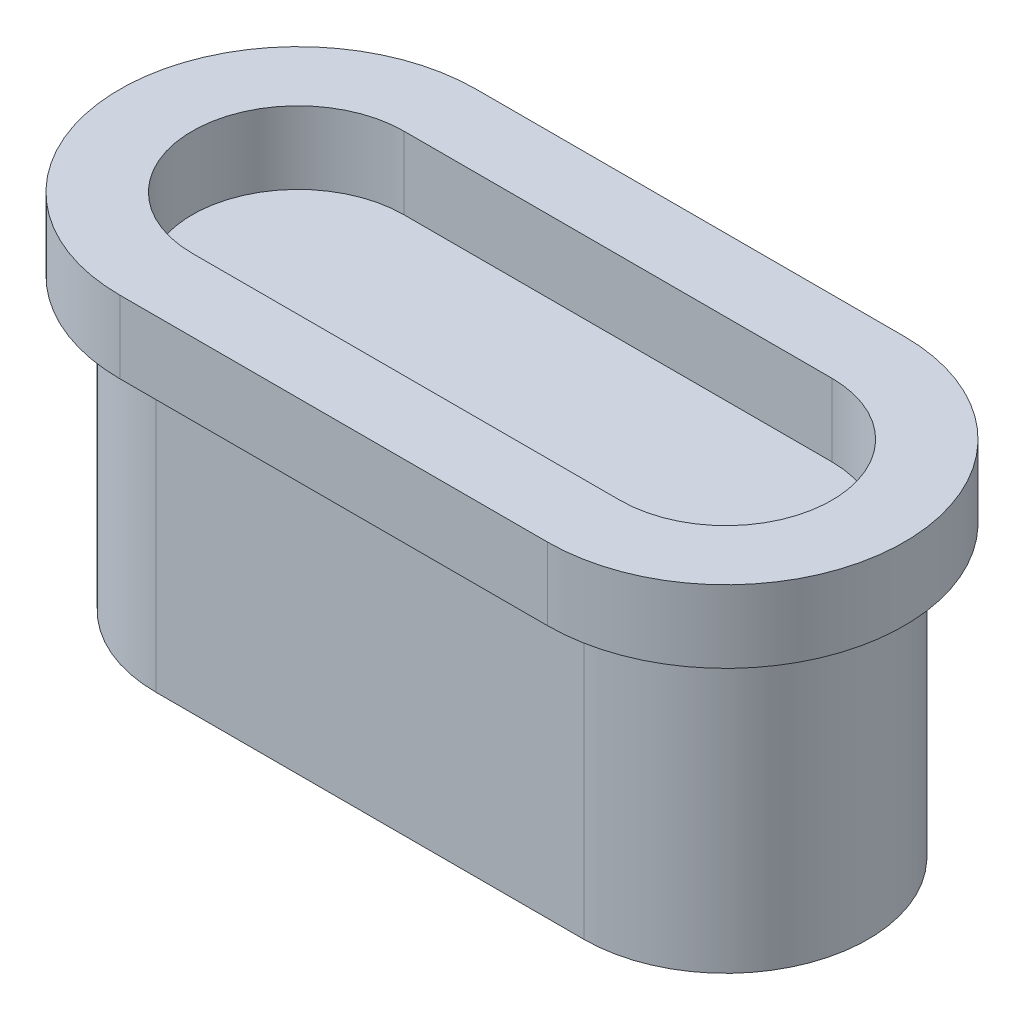
ISO-10303-21;
HEADER;
FILE_DESCRIPTION(('STEP AP214'),'2;1');
FILE_NAME('part.step','',(''),(''),'','','');
FILE_SCHEMA(('AUTOMOTIVE_DESIGN { 1 0 10303 214 1 1 1 1 }'));
ENDSEC;
DATA;
#1=APPLICATION_CONTEXT('core data for automotive mechanical design processes');
#2=APPLICATION_PROTOCOL_DEFINITION('international standard','automotive_design',2000,#1);
#3=PRODUCT_CONTEXT('',#1,'mechanical');
#4=PRODUCT('Part','Part','',(#3));
#5=PRODUCT_RELATED_PRODUCT_CATEGORY('part','',(#4));
#6=PRODUCT_DEFINITION_FORMATION('','',#4);
#7=PRODUCT_DEFINITION_CONTEXT('part definition',#1,'design');
#8=PRODUCT_DEFINITION('design','',#6,#7);
#9=PRODUCT_DEFINITION_SHAPE('','',#8);
#10=(LENGTH_UNIT() NAMED_UNIT(*) SI_UNIT(.MILLI.,.METRE.));
#11=(NAMED_UNIT(*) PLANE_ANGLE_UNIT() SI_UNIT($,.RADIAN.));
#12=(NAMED_UNIT(*) SI_UNIT($,.STERADIAN.) SOLID_ANGLE_UNIT());
#13=UNCERTAINTY_MEASURE_WITH_UNIT(LENGTH_MEASURE(1.E-05),#10,'distance_accuracy_value','');
#14=(GEOMETRIC_REPRESENTATION_CONTEXT(3) GLOBAL_UNCERTAINTY_ASSIGNED_CONTEXT((#13)) GLOBAL_UNIT_ASSIGNED_CONTEXT((#10,
#11,#12)) REPRESENTATION_CONTEXT('',''));
#15=CARTESIAN_POINT('',(0.,0.,0.));
#16=DIRECTION('',(0.,0.,1.));
#17=DIRECTION('',(1.,0.,0.));
#18=AXIS2_PLACEMENT_3D('',#15,#16,#17);
#19=CARTESIAN_POINT('',(0.,-20.,0.));
#20=DIRECTION('',(0.,1.,0.));
#21=DIRECTION('',(0.,0.,1.));
#22=AXIS2_PLACEMENT_3D('',#19,#20,#21);
#23=CYLINDRICAL_SURFACE('',#22,19.6126277365978);
#24=DIRECTION('',(0.,1.,0.));
#25=VECTOR('',#24,1.);
#26=CARTESIAN_POINT('',(0.,-20.,19.6126277365978));
#27=LINE('',#26,#25);
#28=CARTESIAN_POINT('',(0.,-20.,19.6126277365978));
#29=VERTEX_POINT('',#28);
#30=CARTESIAN_POINT('',(0.,20.,19.6126277365978));
#31=VERTEX_POINT('',#30);
#32=EDGE_CURVE('E66',#29,#31,#27,.T.);
#33=ORIENTED_EDGE('',*,*,#32,.T.);
#34=CARTESIAN_POINT('',(0.,20.,0.));
#35=DIRECTION('',(0.,1.,0.));
#36=DIRECTION('',(0.,0.,1.));
#37=AXIS2_PLACEMENT_3D('',#34,#35,#36);
#38=CIRCLE('',#37,19.6126277365978);
#39=CARTESIAN_POINT('',(0.,20.,-19.6126277365978));
#40=VERTEX_POINT('',#39);
#41=EDGE_CURVE('E217',#40,#31,#38,.T.);
#42=ORIENTED_EDGE('',*,*,#41,.F.);
#43=DIRECTION('',(0.,1.,0.));
#44=VECTOR('',#43,1.);
#45=CARTESIAN_POINT('',(0.,-20.,-19.6126277365978));
#46=LINE('',#45,#44);
#47=CARTESIAN_POINT('',(0.,-20.,-19.6126277365978));
#48=VERTEX_POINT('',#47);
#49=EDGE_CURVE('E12',#48,#40,#46,.T.);
#50=ORIENTED_EDGE('',*,*,#49,.F.);
#51=CARTESIAN_POINT('',(0.,-20.,0.));
#52=DIRECTION('',(0.,1.,0.));
#53=DIRECTION('',(0.,0.,1.));
#54=AXIS2_PLACEMENT_3D('',#51,#52,#53);
#55=CIRCLE('',#54,19.6126277365978);
#56=EDGE_CURVE('E229',#48,#29,#55,.T.);
#57=ORIENTED_EDGE('',*,*,#56,.T.);
#58=EDGE_LOOP('',(#33,#42,#50,#57));
#59=FACE_BOUND('',#58,.T.);
#60=ADVANCED_FACE('F63',(#59),#23,.T.);
#61=CARTESIAN_POINT('',(0.,-20.,-19.6126277365978));
#62=DIRECTION('',(0.,0.,-1.));
#63=DIRECTION('',(-1.,0.,0.));
#64=AXIS2_PLACEMENT_3D('',#61,#62,#63);
#65=PLANE('',#64);
#66=ORIENTED_EDGE('',*,*,#49,.T.);
#67=DIRECTION('',(-1.,0.,0.));
#68=VECTOR('',#67,1.);
#69=CARTESIAN_POINT('',(0.,20.,-19.6126277365978));
#70=LINE('',#69,#68);
#71=CARTESIAN_POINT('',(59.0925926609183,20.,-19.6126277365978));
#72=VERTEX_POINT('',#71);
#73=EDGE_CURVE('E226',#72,#40,#70,.T.);
#74=ORIENTED_EDGE('',*,*,#73,.F.);
#75=DIRECTION('',(0.,1.,0.));
#76=VECTOR('',#75,1.);
#77=CARTESIAN_POINT('',(59.0925926609183,-20.,-19.6126277365978));
#78=LINE('',#77,#76);
#79=CARTESIAN_POINT('',(59.0925926609183,-20.,-19.6126277365978));
#80=VERTEX_POINT('',#79);
#81=EDGE_CURVE('E71',#80,#72,#78,.T.);
#82=ORIENTED_EDGE('',*,*,#81,.F.);
#83=DIRECTION('',(-1.,0.,0.));
#84=VECTOR('',#83,1.);
#85=CARTESIAN_POINT('',(0.,-20.,-19.6126277365978));
#86=LINE('',#85,#84);
#87=EDGE_CURVE('E238',#80,#48,#86,.T.);
#88=ORIENTED_EDGE('',*,*,#87,.T.);
#89=EDGE_LOOP('',(#66,#74,#82,#88));
#90=FACE_BOUND('',#89,.T.);
#91=ADVANCED_FACE('F255',(#90),#65,.T.);
#92=CARTESIAN_POINT('',(59.0925926609183,-20.,0.));
#93=DIRECTION('',(0.,1.,0.));
#94=DIRECTION('',(0.,0.,1.));
#95=AXIS2_PLACEMENT_3D('',#92,#93,#94);
#96=CYLINDRICAL_SURFACE('',#95,19.6126277365978);
#97=ORIENTED_EDGE('',*,*,#81,.T.);
#98=CARTESIAN_POINT('',(59.0925926609183,20.,0.));
#99=DIRECTION('',(0.,1.,0.));
#100=DIRECTION('',(0.,0.,1.));
#101=AXIS2_PLACEMENT_3D('',#98,#99,#100);
#102=CIRCLE('',#101,19.6126277365978);
#103=CARTESIAN_POINT('',(59.0925926609183,20.,19.6126277365978));
#104=VERTEX_POINT('',#103);
#105=EDGE_CURVE('E223',#104,#72,#102,.T.);
#106=ORIENTED_EDGE('',*,*,#105,.F.);
#107=DIRECTION('',(0.,1.,0.));
#108=VECTOR('',#107,1.);
#109=CARTESIAN_POINT('',(59.0925926609183,-20.,19.6126277365978));
#110=LINE('',#109,#108);
#111=CARTESIAN_POINT('',(59.0925926609183,-20.,19.6126277365978));
#112=VERTEX_POINT('',#111);
#113=EDGE_CURVE('E241',#112,#104,#110,.T.);
#114=ORIENTED_EDGE('',*,*,#113,.F.);
#115=CARTESIAN_POINT('',(59.0925926609183,-20.,0.));
#116=DIRECTION('',(0.,1.,0.));
#117=DIRECTION('',(0.,0.,1.));
#118=AXIS2_PLACEMENT_3D('',#115,#116,#117);
#119=CIRCLE('',#118,19.6126277365978);
#120=EDGE_CURVE('E235',#112,#80,#119,.T.);
#121=ORIENTED_EDGE('',*,*,#120,.T.);
#122=EDGE_LOOP('',(#97,#106,#114,#121));
#123=FACE_BOUND('',#122,.T.);
#124=ADVANCED_FACE('F261',(#123),#96,.T.);
#125=CARTESIAN_POINT('',(0.,-20.,19.6126277365978));
#126=DIRECTION('',(0.,0.,1.));
#127=DIRECTION('',(1.,0.,0.));
#128=AXIS2_PLACEMENT_3D('',#125,#126,#127);
#129=PLANE('',#128);
#130=ORIENTED_EDGE('',*,*,#113,.T.);
#131=DIRECTION('',(1.,0.,0.));
#132=VECTOR('',#131,1.);
#133=CARTESIAN_POINT('',(0.,20.,19.6126277365978));
#134=LINE('',#133,#132);
#135=EDGE_CURVE('E220',#31,#104,#134,.T.);
#136=ORIENTED_EDGE('',*,*,#135,.F.);
#137=ORIENTED_EDGE('',*,*,#32,.F.);
#138=DIRECTION('',(1.,0.,0.));
#139=VECTOR('',#138,1.);
#140=CARTESIAN_POINT('',(0.,-20.,19.6126277365978));
#141=LINE('',#140,#139);
#142=EDGE_CURVE('E232',#29,#112,#141,.T.);
#143=ORIENTED_EDGE('',*,*,#142,.T.);
#144=EDGE_LOOP('',(#130,#136,#137,#143));
#145=FACE_BOUND('',#144,.T.);
#146=ADVANCED_FACE('F249',(#145),#129,.T.);
#147=CARTESIAN_POINT('',(0.,-20.,0.));
#148=DIRECTION('',(0.,1.,0.));
#149=DIRECTION('',(0.,0.,1.));
#150=AXIS2_PLACEMENT_3D('',#147,#148,#149);
#151=PLANE('',#150);
#152=ORIENTED_EDGE('',*,*,#56,.F.);
#153=ORIENTED_EDGE('',*,*,#87,.F.);
#154=ORIENTED_EDGE('',*,*,#120,.F.);
#155=ORIENTED_EDGE('',*,*,#142,.F.);
#156=EDGE_LOOP('',(#152,#153,#154,#155));
#157=FACE_BOUND('',#156,.T.);
#158=ADVANCED_FACE('F258',(#157),#151,.F.);
#159=CARTESIAN_POINT('',(0.,30.,0.));
#160=DIRECTION('',(0.,1.,0.));
#161=DIRECTION('',(0.,0.,1.));
#162=AXIS2_PLACEMENT_3D('',#159,#160,#161);
#163=PLANE('',#162);
#164=CARTESIAN_POINT('',(0.,30.,0.));
#165=DIRECTION('',(0.,1.,0.));
#166=DIRECTION('',(1.,0.,0.));
#167=AXIS2_PLACEMENT_3D('',#164,#165,#166);
#168=CIRCLE('',#167,24.6126277365978);
#169=CARTESIAN_POINT('',(0.,30.,-24.6126277365978));
#170=VERTEX_POINT('',#169);
#171=CARTESIAN_POINT('',(0.,30.,24.6126277365978));
#172=VERTEX_POINT('',#171);
#173=EDGE_CURVE('E188',#170,#172,#168,.T.);
#174=ORIENTED_EDGE('',*,*,#173,.T.);
#175=DIRECTION('',(1.,0.,0.));
#176=VECTOR('',#175,1.);
#177=CARTESIAN_POINT('',(0.,30.,24.6126277365978));
#178=LINE('',#177,#176);
#179=CARTESIAN_POINT('',(59.0925926609183,30.,24.6126277365978));
#180=VERTEX_POINT('',#179);
#181=EDGE_CURVE('E191',#172,#180,#178,.T.);
#182=ORIENTED_EDGE('',*,*,#181,.T.);
#183=CARTESIAN_POINT('',(59.0925926609183,30.,0.));
#184=DIRECTION('',(0.,1.,0.));
#185=DIRECTION('',(1.,0.,0.));
#186=AXIS2_PLACEMENT_3D('',#183,#184,#185);
#187=CIRCLE('',#186,24.6126277365978);
#188=CARTESIAN_POINT('',(59.0925926609183,30.,-24.6126277365978));
#189=VERTEX_POINT('',#188);
#190=EDGE_CURVE('E194',#180,#189,#187,.T.);
#191=ORIENTED_EDGE('',*,*,#190,.T.);
#192=DIRECTION('',(-1.,0.,0.));
#193=VECTOR('',#192,1.);
#194=CARTESIAN_POINT('',(59.0925926609183,30.,-24.6126277365978));
#195=LINE('',#194,#193);
#196=EDGE_CURVE('E196',#189,#170,#195,.T.);
#197=ORIENTED_EDGE('',*,*,#196,.T.);
#198=EDGE_LOOP('',(#174,#182,#191,#197));
#199=FACE_BOUND('',#198,.T.);
#200=DIRECTION('',(1.,0.,0.));
#201=VECTOR('',#200,1.);
#202=CARTESIAN_POINT('',(0.,30.,14.6126277365978));
#203=LINE('',#202,#201);
#204=CARTESIAN_POINT('',(0.,30.,14.6126277365978));
#205=VERTEX_POINT('',#204);
#206=CARTESIAN_POINT('',(59.0925926609183,30.,14.6126277365978));
#207=VERTEX_POINT('',#206);
#208=EDGE_CURVE('E160',#205,#207,#203,.T.);
#209=ORIENTED_EDGE('',*,*,#208,.F.);
#210=CARTESIAN_POINT('',(0.,30.,0.));
#211=DIRECTION('',(0.,1.,0.));
#212=DIRECTION('',(1.,0.,0.));
#213=AXIS2_PLACEMENT_3D('',#210,#211,#212);
#214=CIRCLE('',#213,14.6126277365978);
#215=CARTESIAN_POINT('',(0.,30.,-14.6126277365978));
#216=VERTEX_POINT('',#215);
#217=EDGE_CURVE('E151',#216,#205,#214,.T.);
#218=ORIENTED_EDGE('',*,*,#217,.F.);
#219=DIRECTION('',(-1.,0.,0.));
#220=VECTOR('',#219,1.);
#221=CARTESIAN_POINT('',(59.0925926609183,30.,-14.6126277365978));
#222=LINE('',#221,#220);
#223=CARTESIAN_POINT('',(59.0925926609183,30.,-14.6126277365978));
#224=VERTEX_POINT('',#223);
#225=EDGE_CURVE('E174',#224,#216,#222,.T.);
#226=ORIENTED_EDGE('',*,*,#225,.F.);
#227=CARTESIAN_POINT('',(59.0925926609183,30.,0.));
#228=DIRECTION('',(0.,1.,0.));
#229=DIRECTION('',(1.,0.,0.));
#230=AXIS2_PLACEMENT_3D('',#227,#228,#229);
#231=CIRCLE('',#230,14.6126277365978);
#232=EDGE_CURVE('E172',#207,#224,#231,.T.);
#233=ORIENTED_EDGE('',*,*,#232,.F.);
#234=EDGE_LOOP('',(#209,#218,#226,#233));
#235=FACE_BOUND('',#234,.T.);
#236=ADVANCED_FACE('F170',(#199,#235),#163,.T.);
#237=CARTESIAN_POINT('',(0.,20.,0.));
#238=DIRECTION('',(0.,1.,0.));
#239=DIRECTION('',(0.,0.,1.));
#240=AXIS2_PLACEMENT_3D('',#237,#238,#239);
#241=PLANE('',#240);
#242=ORIENTED_EDGE('',*,*,#41,.T.);
#243=ORIENTED_EDGE('',*,*,#135,.T.);
#244=ORIENTED_EDGE('',*,*,#105,.T.);
#245=ORIENTED_EDGE('',*,*,#73,.T.);
#246=EDGE_LOOP('',(#242,#243,#244,#245));
#247=FACE_BOUND('',#246,.T.);
#248=CARTESIAN_POINT('',(0.,20.,0.));
#249=DIRECTION('',(0.,1.,0.));
#250=DIRECTION('',(1.,0.,0.));
#251=AXIS2_PLACEMENT_3D('',#248,#249,#250);
#252=CIRCLE('',#251,24.6126277365978);
#253=CARTESIAN_POINT('',(0.,20.,-24.6126277365978));
#254=VERTEX_POINT('',#253);
#255=CARTESIAN_POINT('',(0.,20.,24.6126277365978));
#256=VERTEX_POINT('',#255);
#257=EDGE_CURVE('E166',#254,#256,#252,.T.);
#258=ORIENTED_EDGE('',*,*,#257,.F.);
#259=DIRECTION('',(-1.,0.,0.));
#260=VECTOR('',#259,1.);
#261=CARTESIAN_POINT('',(59.0925926609183,20.,-24.6126277365978));
#262=LINE('',#261,#260);
#263=CARTESIAN_POINT('',(59.0925926609183,20.,-24.6126277365978));
#264=VERTEX_POINT('',#263);
#265=EDGE_CURVE('E192',#264,#254,#262,.T.);
#266=ORIENTED_EDGE('',*,*,#265,.F.);
#267=CARTESIAN_POINT('',(59.0925926609183,20.,0.));
#268=DIRECTION('',(0.,1.,0.));
#269=DIRECTION('',(1.,0.,0.));
#270=AXIS2_PLACEMENT_3D('',#267,#268,#269);
#271=CIRCLE('',#270,24.6126277365978);
#272=CARTESIAN_POINT('',(59.0925926609183,20.,24.6126277365978));
#273=VERTEX_POINT('',#272);
#274=EDGE_CURVE('E203',#273,#264,#271,.T.);
#275=ORIENTED_EDGE('',*,*,#274,.F.);
#276=DIRECTION('',(1.,0.,0.));
#277=VECTOR('',#276,1.);
#278=CARTESIAN_POINT('',(0.,20.,24.6126277365978));
#279=LINE('',#278,#277);
#280=EDGE_CURVE('E201',#256,#273,#279,.T.);
#281=ORIENTED_EDGE('',*,*,#280,.F.);
#282=EDGE_LOOP('',(#258,#266,#275,#281));
#283=FACE_BOUND('',#282,.T.);
#284=ADVANCED_FACE('F251',(#247,#283),#241,.F.);
#285=CARTESIAN_POINT('',(0.,30.,0.));
#286=DIRECTION('',(0.,-1.,0.));
#287=DIRECTION('',(0.,0.,-1.));
#288=AXIS2_PLACEMENT_3D('',#285,#286,#287);
#289=CYLINDRICAL_SURFACE('',#288,24.6126277365978);
#290=ORIENTED_EDGE('',*,*,#257,.T.);
#291=DIRECTION('',(0.,-1.,0.));
#292=VECTOR('',#291,1.);
#293=CARTESIAN_POINT('',(0.,30.,24.6126277365978));
#294=LINE('',#293,#292);
#295=EDGE_CURVE('E214',#172,#256,#294,.T.);
#296=ORIENTED_EDGE('',*,*,#295,.F.);
#297=ORIENTED_EDGE('',*,*,#173,.F.);
#298=DIRECTION('',(0.,-1.,0.));
#299=VECTOR('',#298,1.);
#300=CARTESIAN_POINT('',(0.,30.,-24.6126277365978));
#301=LINE('',#300,#299);
#302=EDGE_CURVE('E198',#170,#254,#301,.T.);
#303=ORIENTED_EDGE('',*,*,#302,.T.);
#304=EDGE_LOOP('',(#290,#296,#297,#303));
#305=FACE_BOUND('',#304,.T.);
#306=ADVANCED_FACE('F312',(#305),#289,.T.);
#307=CARTESIAN_POINT('',(0.,30.,24.6126277365978));
#308=DIRECTION('',(0.,0.,-1.));
#309=DIRECTION('',(-1.,0.,0.));
#310=AXIS2_PLACEMENT_3D('',#307,#308,#309);
#311=PLANE('',#310);
#312=ORIENTED_EDGE('',*,*,#280,.T.);
#313=DIRECTION('',(0.,-1.,0.));
#314=VECTOR('',#313,1.);
#315=CARTESIAN_POINT('',(59.0925926609183,30.,24.6126277365978));
#316=LINE('',#315,#314);
#317=EDGE_CURVE('E211',#180,#273,#316,.T.);
#318=ORIENTED_EDGE('',*,*,#317,.F.);
#319=ORIENTED_EDGE('',*,*,#181,.F.);
#320=ORIENTED_EDGE('',*,*,#295,.T.);
#321=EDGE_LOOP('',(#312,#318,#319,#320));
#322=FACE_BOUND('',#321,.T.);
#323=ADVANCED_FACE('F322',(#322),#311,.F.);
#324=CARTESIAN_POINT('',(59.0925926609183,30.,0.));
#325=DIRECTION('',(0.,-1.,0.));
#326=DIRECTION('',(0.,0.,-1.));
#327=AXIS2_PLACEMENT_3D('',#324,#325,#326);
#328=CYLINDRICAL_SURFACE('',#327,24.6126277365978);
#329=ORIENTED_EDGE('',*,*,#274,.T.);
#330=DIRECTION('',(0.,-1.,0.));
#331=VECTOR('',#330,1.);
#332=CARTESIAN_POINT('',(59.0925926609183,30.,-24.6126277365978));
#333=LINE('',#332,#331);
#334=EDGE_CURVE('E208',#189,#264,#333,.T.);
#335=ORIENTED_EDGE('',*,*,#334,.F.);
#336=ORIENTED_EDGE('',*,*,#190,.F.);
#337=ORIENTED_EDGE('',*,*,#317,.T.);
#338=EDGE_LOOP('',(#329,#335,#336,#337));
#339=FACE_BOUND('',#338,.T.);
#340=ADVANCED_FACE('F333',(#339),#328,.T.);
#341=CARTESIAN_POINT('',(59.0925926609183,30.,-24.6126277365978));
#342=DIRECTION('',(0.,0.,1.));
#343=DIRECTION('',(1.,0.,0.));
#344=AXIS2_PLACEMENT_3D('',#341,#342,#343);
#345=PLANE('',#344);
#346=ORIENTED_EDGE('',*,*,#265,.T.);
#347=ORIENTED_EDGE('',*,*,#302,.F.);
#348=ORIENTED_EDGE('',*,*,#196,.F.);
#349=ORIENTED_EDGE('',*,*,#334,.T.);
#350=EDGE_LOOP('',(#346,#347,#348,#349));
#351=FACE_BOUND('',#350,.T.);
#352=ADVANCED_FACE('F344',(#351),#345,.F.);
#353=CARTESIAN_POINT('',(0.,30.,0.));
#354=DIRECTION('',(0.,-1.,0.));
#355=DIRECTION('',(0.,0.,-1.));
#356=AXIS2_PLACEMENT_3D('',#353,#354,#355);
#357=CYLINDRICAL_SURFACE('',#356,14.6126277365978);
#358=CARTESIAN_POINT('',(0.,20.,0.));
#359=DIRECTION('',(0.,1.,0.));
#360=DIRECTION('',(1.,0.,0.));
#361=AXIS2_PLACEMENT_3D('',#358,#359,#360);
#362=CIRCLE('',#361,14.6126277365978);
#363=CARTESIAN_POINT('',(0.,20.,-14.6126277365978));
#364=VERTEX_POINT('',#363);
#365=CARTESIAN_POINT('',(0.,20.,14.6126277365978));
#366=VERTEX_POINT('',#365);
#367=EDGE_CURVE('E79',#364,#366,#362,.T.);
#368=ORIENTED_EDGE('',*,*,#367,.F.);
#369=DIRECTION('',(0.,-1.,0.));
#370=VECTOR('',#369,1.);
#371=CARTESIAN_POINT('',(0.,30.,-14.6126277365978));
#372=LINE('',#371,#370);
#373=EDGE_CURVE('E156',#216,#364,#372,.T.);
#374=ORIENTED_EDGE('',*,*,#373,.F.);
#375=ORIENTED_EDGE('',*,*,#217,.T.);
#376=DIRECTION('',(0.,-1.,0.));
#377=VECTOR('',#376,1.);
#378=CARTESIAN_POINT('',(0.,30.,14.6126277365978));
#379=LINE('',#378,#377);
#380=EDGE_CURVE('E154',#205,#366,#379,.T.);
#381=ORIENTED_EDGE('',*,*,#380,.T.);
#382=EDGE_LOOP('',(#368,#374,#375,#381));
#383=FACE_BOUND('',#382,.T.);
#384=ADVANCED_FACE('F153',(#383),#357,.F.);
#385=CARTESIAN_POINT('',(0.,30.,14.6126277365978));
#386=DIRECTION('',(0.,0.,-1.));
#387=DIRECTION('',(-1.,0.,0.));
#388=AXIS2_PLACEMENT_3D('',#385,#386,#387);
#389=PLANE('',#388);
#390=DIRECTION('',(1.,0.,0.));
#391=VECTOR('',#390,1.);
#392=CARTESIAN_POINT('',(0.,20.,14.6126277365978));
#393=LINE('',#392,#391);
#394=CARTESIAN_POINT('',(59.0925926609183,20.,14.6126277365978));
#395=VERTEX_POINT('',#394);
#396=EDGE_CURVE('E83',#366,#395,#393,.T.);
#397=ORIENTED_EDGE('',*,*,#396,.F.);
#398=ORIENTED_EDGE('',*,*,#380,.F.);
#399=ORIENTED_EDGE('',*,*,#208,.T.);
#400=DIRECTION('',(0.,-1.,0.));
#401=VECTOR('',#400,1.);
#402=CARTESIAN_POINT('',(59.0925926609183,30.,14.6126277365978));
#403=LINE('',#402,#401);
#404=EDGE_CURVE('E167',#207,#395,#403,.T.);
#405=ORIENTED_EDGE('',*,*,#404,.T.);
#406=EDGE_LOOP('',(#397,#398,#399,#405));
#407=FACE_BOUND('',#406,.T.);
#408=ADVANCED_FACE('F164',(#407),#389,.T.);
#409=CARTESIAN_POINT('',(59.0925926609183,30.,0.));
#410=DIRECTION('',(0.,-1.,0.));
#411=DIRECTION('',(0.,0.,-1.));
#412=AXIS2_PLACEMENT_3D('',#409,#410,#411);
#413=CYLINDRICAL_SURFACE('',#412,14.6126277365978);
#414=CARTESIAN_POINT('',(59.0925926609183,20.,0.));
#415=DIRECTION('',(0.,1.,0.));
#416=DIRECTION('',(1.,0.,0.));
#417=AXIS2_PLACEMENT_3D('',#414,#415,#416);
#418=CIRCLE('',#417,14.6126277365978);
#419=CARTESIAN_POINT('',(59.0925926609183,20.,-14.6126277365978));
#420=VERTEX_POINT('',#419);
#421=EDGE_CURVE('E180',#395,#420,#418,.T.);
#422=ORIENTED_EDGE('',*,*,#421,.F.);
#423=ORIENTED_EDGE('',*,*,#404,.F.);
#424=ORIENTED_EDGE('',*,*,#232,.T.);
#425=DIRECTION('',(0.,-1.,0.));
#426=VECTOR('',#425,1.);
#427=CARTESIAN_POINT('',(59.0925926609183,30.,-14.6126277365978));
#428=LINE('',#427,#426);
#429=EDGE_CURVE('E184',#224,#420,#428,.T.);
#430=ORIENTED_EDGE('',*,*,#429,.T.);
#431=EDGE_LOOP('',(#422,#423,#424,#430));
#432=FACE_BOUND('',#431,.T.);
#433=ADVANCED_FACE('F374',(#432),#413,.F.);
#434=CARTESIAN_POINT('',(59.0925926609183,30.,-14.6126277365978));
#435=DIRECTION('',(0.,0.,1.));
#436=DIRECTION('',(1.,0.,0.));
#437=AXIS2_PLACEMENT_3D('',#434,#435,#436);
#438=PLANE('',#437);
#439=DIRECTION('',(-1.,0.,0.));
#440=VECTOR('',#439,1.);
#441=CARTESIAN_POINT('',(59.0925926609183,20.,-14.6126277365978));
#442=LINE('',#441,#440);
#443=EDGE_CURVE('E161',#420,#364,#442,.T.);
#444=ORIENTED_EDGE('',*,*,#443,.F.);
#445=ORIENTED_EDGE('',*,*,#429,.F.);
#446=ORIENTED_EDGE('',*,*,#225,.T.);
#447=ORIENTED_EDGE('',*,*,#373,.T.);
#448=EDGE_LOOP('',(#444,#445,#446,#447));
#449=FACE_BOUND('',#448,.T.);
#450=ADVANCED_FACE('F384',(#449),#438,.T.);
#451=CARTESIAN_POINT('',(0.,20.,0.));
#452=DIRECTION('',(0.,1.,0.));
#453=DIRECTION('',(0.,0.,1.));
#454=AXIS2_PLACEMENT_3D('',#451,#452,#453);
#455=PLANE('',#454);
#456=ORIENTED_EDGE('',*,*,#367,.T.);
#457=ORIENTED_EDGE('',*,*,#396,.T.);
#458=ORIENTED_EDGE('',*,*,#421,.T.);
#459=ORIENTED_EDGE('',*,*,#443,.T.);
#460=EDGE_LOOP('',(#456,#457,#458,#459));
#461=FACE_BOUND('',#460,.T.);
#462=ADVANCED_FACE('F395',(#461),#455,.T.);
#463=CLOSED_SHELL('',(#60,#91,#124,#146,#158,#236,#284,#306,#323,#340,#352,#384,#408,#433,#450,#462));
#464=MANIFOLD_SOLID_BREP('B2',#463);
#465=ADVANCED_BREP_SHAPE_REPRESENTATION('',(#18,#464),#14);
#466=SHAPE_DEFINITION_REPRESENTATION(#9,#465);
ENDSEC;
END-ISO-10303-21;
